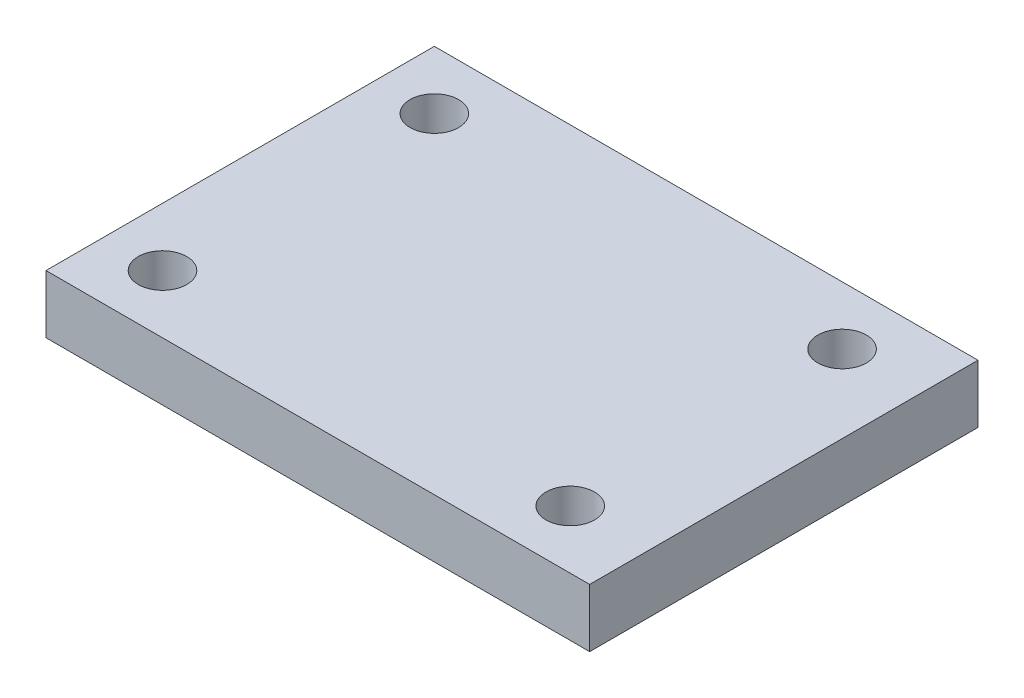
ISO-10303-21;
HEADER;
FILE_DESCRIPTION(('STEP AP214'),'2;1');
FILE_NAME('part.step','',(''),(''),'','','');
FILE_SCHEMA(('AUTOMOTIVE_DESIGN { 1 0 10303 214 1 1 1 1 }'));
ENDSEC;
DATA;
#1=APPLICATION_CONTEXT('core data for automotive mechanical design processes');
#2=APPLICATION_PROTOCOL_DEFINITION('international standard','automotive_design',2000,#1);
#3=PRODUCT_CONTEXT('',#1,'mechanical');
#4=PRODUCT('Part','Part','',(#3));
#5=PRODUCT_RELATED_PRODUCT_CATEGORY('part','',(#4));
#6=PRODUCT_DEFINITION_FORMATION('','',#4);
#7=PRODUCT_DEFINITION_CONTEXT('part definition',#1,'design');
#8=PRODUCT_DEFINITION('design','',#6,#7);
#9=PRODUCT_DEFINITION_SHAPE('','',#8);
#10=(LENGTH_UNIT() NAMED_UNIT(*) SI_UNIT(.MILLI.,.METRE.));
#11=(NAMED_UNIT(*) PLANE_ANGLE_UNIT() SI_UNIT($,.RADIAN.));
#12=(NAMED_UNIT(*) SI_UNIT($,.STERADIAN.) SOLID_ANGLE_UNIT());
#13=UNCERTAINTY_MEASURE_WITH_UNIT(LENGTH_MEASURE(1.E-05),#10,'distance_accuracy_value','');
#14=(GEOMETRIC_REPRESENTATION_CONTEXT(3) GLOBAL_UNCERTAINTY_ASSIGNED_CONTEXT((#13)) GLOBAL_UNIT_ASSIGNED_CONTEXT((#10,
#11,#12)) REPRESENTATION_CONTEXT('',''));
#15=CARTESIAN_POINT('',(0.,0.,0.));
#16=DIRECTION('',(0.,0.,1.));
#17=DIRECTION('',(1.,0.,0.));
#18=AXIS2_PLACEMENT_3D('',#15,#16,#17);
#19=CARTESIAN_POINT('',(14.,-3.,-10.));
#20=DIRECTION('',(1.,0.,0.));
#21=DIRECTION('',(0.,0.,-1.));
#22=AXIS2_PLACEMENT_3D('',#19,#20,#21);
#23=PLANE('',#22);
#24=DIRECTION('',(0.,0.,-1.));
#25=VECTOR('',#24,1.);
#26=CARTESIAN_POINT('',(14.,0.,-10.));
#27=LINE('',#26,#25);
#28=CARTESIAN_POINT('',(14.,0.,10.));
#29=VERTEX_POINT('',#28);
#30=CARTESIAN_POINT('',(14.,0.,-10.));
#31=VERTEX_POINT('',#30);
#32=EDGE_CURVE('E117',#29,#31,#27,.T.);
#33=ORIENTED_EDGE('',*,*,#32,.F.);
#34=DIRECTION('',(0.,1.,0.));
#35=VECTOR('',#34,1.);
#36=CARTESIAN_POINT('',(14.,-3.,10.));
#37=LINE('',#36,#35);
#38=CARTESIAN_POINT('',(14.,-3.,10.));
#39=VERTEX_POINT('',#38);
#40=EDGE_CURVE('E11',#39,#29,#37,.T.);
#41=ORIENTED_EDGE('',*,*,#40,.F.);
#42=DIRECTION('',(0.,0.,-1.));
#43=VECTOR('',#42,1.);
#44=CARTESIAN_POINT('',(14.,-3.,-10.));
#45=LINE('',#44,#43);
#46=CARTESIAN_POINT('',(14.,-3.,-10.));
#47=VERTEX_POINT('',#46);
#48=EDGE_CURVE('E108',#39,#47,#45,.T.);
#49=ORIENTED_EDGE('',*,*,#48,.T.);
#50=DIRECTION('',(0.,1.,0.));
#51=VECTOR('',#50,1.);
#52=CARTESIAN_POINT('',(14.,-3.,-10.));
#53=LINE('',#52,#51);
#54=EDGE_CURVE('E49',#47,#31,#53,.T.);
#55=ORIENTED_EDGE('',*,*,#54,.T.);
#56=EDGE_LOOP('',(#33,#41,#49,#55));
#57=FACE_BOUND('',#56,.T.);
#58=ADVANCED_FACE('F46',(#57),#23,.T.);
#59=CARTESIAN_POINT('',(-14.,-3.,10.));
#60=DIRECTION('',(0.,0.,1.));
#61=DIRECTION('',(1.,0.,0.));
#62=AXIS2_PLACEMENT_3D('',#59,#60,#61);
#63=PLANE('',#62);
#64=DIRECTION('',(1.,0.,0.));
#65=VECTOR('',#64,1.);
#66=CARTESIAN_POINT('',(-14.,0.,10.));
#67=LINE('',#66,#65);
#68=CARTESIAN_POINT('',(-14.,0.,10.));
#69=VERTEX_POINT('',#68);
#70=EDGE_CURVE('E111',#69,#29,#67,.T.);
#71=ORIENTED_EDGE('',*,*,#70,.F.);
#72=DIRECTION('',(0.,1.,0.));
#73=VECTOR('',#72,1.);
#74=CARTESIAN_POINT('',(-14.,-3.,10.));
#75=LINE('',#74,#73);
#76=CARTESIAN_POINT('',(-14.,-3.,10.));
#77=VERTEX_POINT('',#76);
#78=EDGE_CURVE('E56',#77,#69,#75,.T.);
#79=ORIENTED_EDGE('',*,*,#78,.F.);
#80=DIRECTION('',(1.,0.,0.));
#81=VECTOR('',#80,1.);
#82=CARTESIAN_POINT('',(-14.,-3.,10.));
#83=LINE('',#82,#81);
#84=EDGE_CURVE('E103',#77,#39,#83,.T.);
#85=ORIENTED_EDGE('',*,*,#84,.T.);
#86=ORIENTED_EDGE('',*,*,#40,.T.);
#87=EDGE_LOOP('',(#71,#79,#85,#86));
#88=FACE_BOUND('',#87,.T.);
#89=ADVANCED_FACE('F134',(#88),#63,.T.);
#90=CARTESIAN_POINT('',(-14.,-3.,-10.));
#91=DIRECTION('',(-1.,0.,0.));
#92=DIRECTION('',(0.,0.,1.));
#93=AXIS2_PLACEMENT_3D('',#90,#91,#92);
#94=PLANE('',#93);
#95=DIRECTION('',(0.,0.,1.));
#96=VECTOR('',#95,1.);
#97=CARTESIAN_POINT('',(-14.,0.,-10.));
#98=LINE('',#97,#96);
#99=CARTESIAN_POINT('',(-14.,0.,-10.));
#100=VERTEX_POINT('',#99);
#101=EDGE_CURVE('E97',#100,#69,#98,.T.);
#102=ORIENTED_EDGE('',*,*,#101,.F.);
#103=DIRECTION('',(0.,1.,0.));
#104=VECTOR('',#103,1.);
#105=CARTESIAN_POINT('',(-14.,-3.,-10.));
#106=LINE('',#105,#104);
#107=CARTESIAN_POINT('',(-14.,-3.,-10.));
#108=VERTEX_POINT('',#107);
#109=EDGE_CURVE('E92',#108,#100,#106,.T.);
#110=ORIENTED_EDGE('',*,*,#109,.F.);
#111=DIRECTION('',(0.,0.,1.));
#112=VECTOR('',#111,1.);
#113=CARTESIAN_POINT('',(-14.,-3.,-10.));
#114=LINE('',#113,#112);
#115=EDGE_CURVE('E95',#108,#77,#114,.T.);
#116=ORIENTED_EDGE('',*,*,#115,.T.);
#117=ORIENTED_EDGE('',*,*,#78,.T.);
#118=EDGE_LOOP('',(#102,#110,#116,#117));
#119=FACE_BOUND('',#118,.T.);
#120=ADVANCED_FACE('F94',(#119),#94,.T.);
#121=CARTESIAN_POINT('',(-14.,-3.,-10.));
#122=DIRECTION('',(0.,0.,-1.));
#123=DIRECTION('',(-1.,0.,0.));
#124=AXIS2_PLACEMENT_3D('',#121,#122,#123);
#125=PLANE('',#124);
#126=DIRECTION('',(-1.,0.,0.));
#127=VECTOR('',#126,1.);
#128=CARTESIAN_POINT('',(-14.,0.,-10.));
#129=LINE('',#128,#127);
#130=EDGE_CURVE('E121',#31,#100,#129,.T.);
#131=ORIENTED_EDGE('',*,*,#130,.F.);
#132=ORIENTED_EDGE('',*,*,#54,.F.);
#133=DIRECTION('',(-1.,0.,0.));
#134=VECTOR('',#133,1.);
#135=CARTESIAN_POINT('',(-14.,-3.,-10.));
#136=LINE('',#135,#134);
#137=EDGE_CURVE('E102',#47,#108,#136,.T.);
#138=ORIENTED_EDGE('',*,*,#137,.T.);
#139=ORIENTED_EDGE('',*,*,#109,.T.);
#140=EDGE_LOOP('',(#131,#132,#138,#139));
#141=FACE_BOUND('',#140,.T.);
#142=ADVANCED_FACE('F106',(#141),#125,.T.);
#143=CARTESIAN_POINT('',(0.,-3.,0.));
#144=DIRECTION('',(0.,1.,0.));
#145=DIRECTION('',(0.,0.,1.));
#146=AXIS2_PLACEMENT_3D('',#143,#144,#145);
#147=PLANE('',#146);
#148=CARTESIAN_POINT('',(-11.,-3.,-7.));
#149=DIRECTION('',(0.,1.,0.));
#150=DIRECTION('',(0.,0.,1.));
#151=AXIS2_PLACEMENT_3D('',#148,#149,#150);
#152=CIRCLE('',#151,1.25);
#153=CARTESIAN_POINT('',(-11.,-3.,-5.75));
#154=VERTEX_POINT('',#153);
#155=EDGE_CURVE('E175',#154,#154,#152,.T.);
#156=ORIENTED_EDGE('',*,*,#155,.T.);
#157=EDGE_LOOP('',(#156));
#158=FACE_BOUND('',#157,.T.);
#159=CARTESIAN_POINT('',(-11.,-3.,7.));
#160=DIRECTION('',(0.,1.,0.));
#161=DIRECTION('',(0.,0.,1.));
#162=AXIS2_PLACEMENT_3D('',#159,#160,#161);
#163=CIRCLE('',#162,1.25);
#164=CARTESIAN_POINT('',(-11.,-3.,8.25));
#165=VERTEX_POINT('',#164);
#166=EDGE_CURVE('E188',#165,#165,#163,.T.);
#167=ORIENTED_EDGE('',*,*,#166,.T.);
#168=EDGE_LOOP('',(#167));
#169=FACE_BOUND('',#168,.T.);
#170=CARTESIAN_POINT('',(9.99999999999999,-3.,-7.));
#171=DIRECTION('',(0.,1.,0.));
#172=DIRECTION('',(0.,0.,1.));
#173=AXIS2_PLACEMENT_3D('',#170,#171,#172);
#174=CIRCLE('',#173,1.25);
#175=CARTESIAN_POINT('',(9.99999999999999,-3.,-5.75));
#176=VERTEX_POINT('',#175);
#177=EDGE_CURVE('E196',#176,#176,#174,.T.);
#178=ORIENTED_EDGE('',*,*,#177,.T.);
#179=EDGE_LOOP('',(#178));
#180=FACE_BOUND('',#179,.T.);
#181=CARTESIAN_POINT('',(9.99999999999999,-3.,7.));
#182=DIRECTION('',(0.,1.,0.));
#183=DIRECTION('',(0.,0.,1.));
#184=AXIS2_PLACEMENT_3D('',#181,#182,#183);
#185=CIRCLE('',#184,1.25);
#186=CARTESIAN_POINT('',(9.99999999999999,-3.,8.25));
#187=VERTEX_POINT('',#186);
#188=EDGE_CURVE('E122',#187,#187,#185,.T.);
#189=ORIENTED_EDGE('',*,*,#188,.T.);
#190=EDGE_LOOP('',(#189));
#191=FACE_BOUND('',#190,.T.);
#192=ORIENTED_EDGE('',*,*,#48,.F.);
#193=ORIENTED_EDGE('',*,*,#84,.F.);
#194=ORIENTED_EDGE('',*,*,#115,.F.);
#195=ORIENTED_EDGE('',*,*,#137,.F.);
#196=EDGE_LOOP('',(#192,#193,#194,#195));
#197=FACE_BOUND('',#196,.T.);
#198=ADVANCED_FACE('F101',(#158,#169,#180,#191,#197),#147,.F.);
#199=CARTESIAN_POINT('',(0.,0.,0.));
#200=DIRECTION('',(0.,1.,0.));
#201=DIRECTION('',(0.,0.,1.));
#202=AXIS2_PLACEMENT_3D('',#199,#200,#201);
#203=PLANE('',#202);
#204=CARTESIAN_POINT('',(-11.,0.,-7.));
#205=DIRECTION('',(0.,1.,0.));
#206=DIRECTION('',(0.,0.,1.));
#207=AXIS2_PLACEMENT_3D('',#204,#205,#206);
#208=CIRCLE('',#207,1.25);
#209=CARTESIAN_POINT('',(-11.,0.,-5.75));
#210=VERTEX_POINT('',#209);
#211=EDGE_CURVE('E178',#210,#210,#208,.T.);
#212=ORIENTED_EDGE('',*,*,#211,.F.);
#213=EDGE_LOOP('',(#212));
#214=FACE_BOUND('',#213,.T.);
#215=CARTESIAN_POINT('',(-11.,0.,7.));
#216=DIRECTION('',(0.,1.,0.));
#217=DIRECTION('',(0.,0.,1.));
#218=AXIS2_PLACEMENT_3D('',#215,#216,#217);
#219=CIRCLE('',#218,1.25);
#220=CARTESIAN_POINT('',(-11.,0.,8.25));
#221=VERTEX_POINT('',#220);
#222=EDGE_CURVE('E182',#221,#221,#219,.T.);
#223=ORIENTED_EDGE('',*,*,#222,.F.);
#224=EDGE_LOOP('',(#223));
#225=FACE_BOUND('',#224,.T.);
#226=CARTESIAN_POINT('',(9.99999999999999,0.,-7.));
#227=DIRECTION('',(0.,1.,0.));
#228=DIRECTION('',(0.,0.,1.));
#229=AXIS2_PLACEMENT_3D('',#226,#227,#228);
#230=CIRCLE('',#229,1.25);
#231=CARTESIAN_POINT('',(9.99999999999999,0.,-5.75));
#232=VERTEX_POINT('',#231);
#233=EDGE_CURVE('E192',#232,#232,#230,.T.);
#234=ORIENTED_EDGE('',*,*,#233,.F.);
#235=EDGE_LOOP('',(#234));
#236=FACE_BOUND('',#235,.T.);
#237=CARTESIAN_POINT('',(9.99999999999999,0.,7.));
#238=DIRECTION('',(0.,1.,0.));
#239=DIRECTION('',(0.,0.,1.));
#240=AXIS2_PLACEMENT_3D('',#237,#238,#239);
#241=CIRCLE('',#240,1.25);
#242=CARTESIAN_POINT('',(9.99999999999999,0.,8.25));
#243=VERTEX_POINT('',#242);
#244=EDGE_CURVE('E200',#243,#243,#241,.T.);
#245=ORIENTED_EDGE('',*,*,#244,.F.);
#246=EDGE_LOOP('',(#245));
#247=FACE_BOUND('',#246,.T.);
#248=ORIENTED_EDGE('',*,*,#32,.T.);
#249=ORIENTED_EDGE('',*,*,#130,.T.);
#250=ORIENTED_EDGE('',*,*,#101,.T.);
#251=ORIENTED_EDGE('',*,*,#70,.T.);
#252=EDGE_LOOP('',(#248,#249,#250,#251));
#253=FACE_BOUND('',#252,.T.);
#254=ADVANCED_FACE('F133',(#214,#225,#236,#247,#253),#203,.T.);
#255=CARTESIAN_POINT('',(9.99999999999999,0.,7.));
#256=DIRECTION('',(0.,1.,0.));
#257=DIRECTION('',(0.,0.,1.));
#258=AXIS2_PLACEMENT_3D('',#255,#256,#257);
#259=CYLINDRICAL_SURFACE('',#258,1.25);
#260=ORIENTED_EDGE('',*,*,#188,.F.);
#261=EDGE_LOOP('',(#260));
#262=FACE_BOUND('',#261,.T.);
#263=ORIENTED_EDGE('',*,*,#244,.T.);
#264=EDGE_LOOP('',(#263));
#265=FACE_BOUND('',#264,.T.);
#266=ADVANCED_FACE('F152',(#262,#265),#259,.F.);
#267=CARTESIAN_POINT('',(9.99999999999999,0.,-7.));
#268=DIRECTION('',(0.,1.,0.));
#269=DIRECTION('',(0.,0.,1.));
#270=AXIS2_PLACEMENT_3D('',#267,#268,#269);
#271=CYLINDRICAL_SURFACE('',#270,1.25);
#272=ORIENTED_EDGE('',*,*,#177,.F.);
#273=EDGE_LOOP('',(#272));
#274=FACE_BOUND('',#273,.T.);
#275=ORIENTED_EDGE('',*,*,#233,.T.);
#276=EDGE_LOOP('',(#275));
#277=FACE_BOUND('',#276,.T.);
#278=ADVANCED_FACE('F159',(#274,#277),#271,.F.);
#279=CARTESIAN_POINT('',(-11.,0.,7.));
#280=DIRECTION('',(0.,1.,0.));
#281=DIRECTION('',(0.,0.,1.));
#282=AXIS2_PLACEMENT_3D('',#279,#280,#281);
#283=CYLINDRICAL_SURFACE('',#282,1.25);
#284=ORIENTED_EDGE('',*,*,#166,.F.);
#285=EDGE_LOOP('',(#284));
#286=FACE_BOUND('',#285,.T.);
#287=ORIENTED_EDGE('',*,*,#222,.T.);
#288=EDGE_LOOP('',(#287));
#289=FACE_BOUND('',#288,.T.);
#290=ADVANCED_FACE('F163',(#286,#289),#283,.F.);
#291=CARTESIAN_POINT('',(-11.,0.,-7.));
#292=DIRECTION('',(0.,1.,0.));
#293=DIRECTION('',(0.,0.,1.));
#294=AXIS2_PLACEMENT_3D('',#291,#292,#293);
#295=CYLINDRICAL_SURFACE('',#294,1.25);
#296=ORIENTED_EDGE('',*,*,#155,.F.);
#297=EDGE_LOOP('',(#296));
#298=FACE_BOUND('',#297,.T.);
#299=ORIENTED_EDGE('',*,*,#211,.T.);
#300=EDGE_LOOP('',(#299));
#301=FACE_BOUND('',#300,.T.);
#302=ADVANCED_FACE('F167',(#298,#301),#295,.F.);
#303=CLOSED_SHELL('',(#58,#89,#120,#142,#198,#254,#266,#278,#290,#302));
#304=MANIFOLD_SOLID_BREP('B2',#303);
#305=ADVANCED_BREP_SHAPE_REPRESENTATION('',(#18,#304),#14);
#306=SHAPE_DEFINITION_REPRESENTATION(#9,#305);
ENDSEC;
END-ISO-10303-21;
